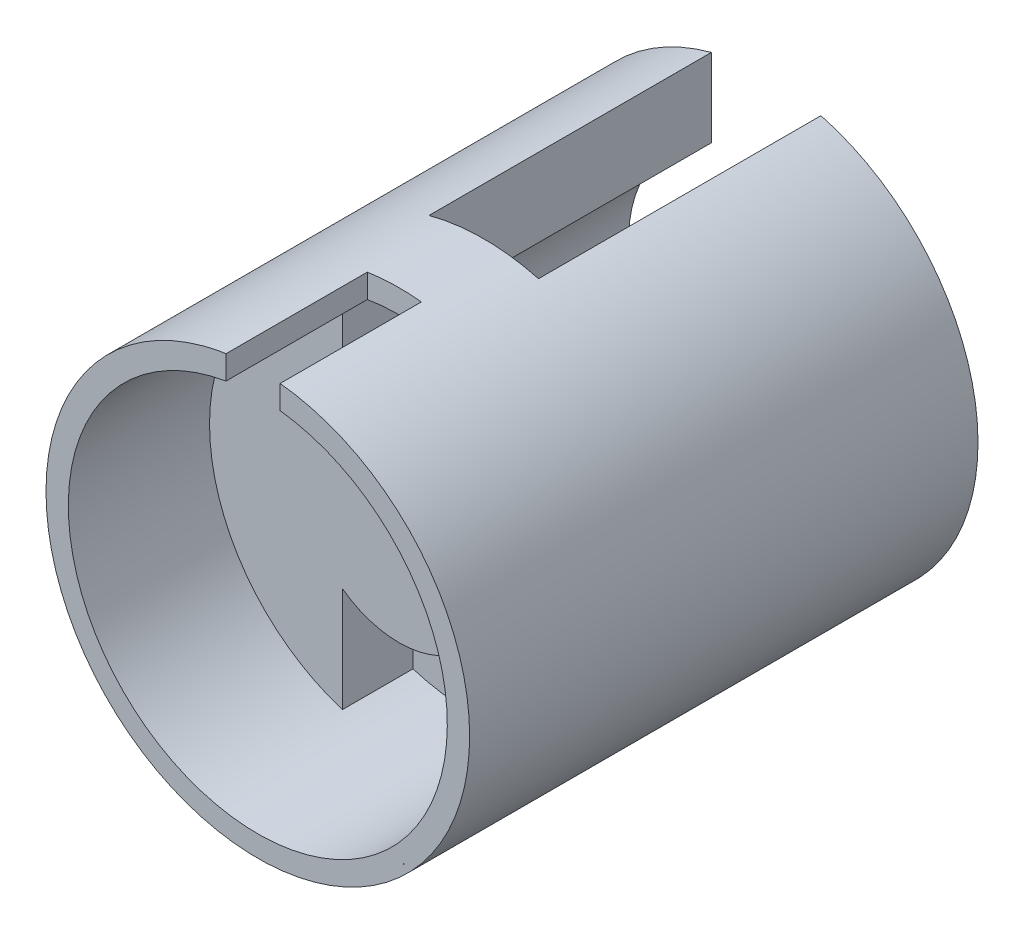
ISO-10303-21;
HEADER;
FILE_DESCRIPTION(('STEP AP214'),'2;1');
FILE_NAME('part.step','',(''),(''),'','','');
FILE_SCHEMA(('AUTOMOTIVE_DESIGN { 1 0 10303 214 1 1 1 1 }'));
ENDSEC;
DATA;
#1=APPLICATION_CONTEXT('core data for automotive mechanical design processes');
#2=APPLICATION_PROTOCOL_DEFINITION('international standard','automotive_design',2000,#1);
#3=PRODUCT_CONTEXT('',#1,'mechanical');
#4=PRODUCT('Part','Part','',(#3));
#5=PRODUCT_RELATED_PRODUCT_CATEGORY('part','',(#4));
#6=PRODUCT_DEFINITION_FORMATION('','',#4);
#7=PRODUCT_DEFINITION_CONTEXT('part definition',#1,'design');
#8=PRODUCT_DEFINITION('design','',#6,#7);
#9=PRODUCT_DEFINITION_SHAPE('','',#8);
#10=(LENGTH_UNIT() NAMED_UNIT(*) SI_UNIT(.MILLI.,.METRE.));
#11=(NAMED_UNIT(*) PLANE_ANGLE_UNIT() SI_UNIT($,.RADIAN.));
#12=(NAMED_UNIT(*) SI_UNIT($,.STERADIAN.) SOLID_ANGLE_UNIT());
#13=UNCERTAINTY_MEASURE_WITH_UNIT(LENGTH_MEASURE(1.E-05),#10,'distance_accuracy_value','');
#14=(GEOMETRIC_REPRESENTATION_CONTEXT(3) GLOBAL_UNCERTAINTY_ASSIGNED_CONTEXT((#13)) GLOBAL_UNIT_ASSIGNED_CONTEXT((#10,
#11,#12)) REPRESENTATION_CONTEXT('',''));
#15=CARTESIAN_POINT('',(0.,0.,0.));
#16=DIRECTION('',(0.,0.,1.));
#17=DIRECTION('',(1.,0.,0.));
#18=AXIS2_PLACEMENT_3D('',#15,#16,#17);
#19=CARTESIAN_POINT('',(0.15315400495503,2.89672992196875,-1.));
#20=DIRECTION('',(0.,0.,-1.));
#21=DIRECTION('',(-1.,0.,0.));
#22=AXIS2_PLACEMENT_3D('',#19,#20,#21);
#23=PLANE('',#22);
#24=CARTESIAN_POINT('',(0.15315400495503,2.89672992196875,-1.));
#25=DIRECTION('',(0.,0.,-1.));
#26=DIRECTION('',(-1.,0.,0.));
#27=AXIS2_PLACEMENT_3D('',#24,#25,#26);
#28=CIRCLE('',#27,9.75);
#29=CARTESIAN_POINT('',(4.03204794869255,11.8419343228327,-1.));
#30=VERTEX_POINT('',#29);
#31=CARTESIAN_POINT('',(-3.72573993878249,11.8419343228327,-1.));
#32=VERTEX_POINT('',#31);
#33=EDGE_CURVE('E89',#30,#32,#28,.T.);
#34=ORIENTED_EDGE('',*,*,#33,.T.);
#35=DIRECTION('',(0.,1.,0.));
#36=VECTOR('',#35,1.);
#37=CARTESIAN_POINT('',(-3.72573993878249,0.,-1.));
#38=LINE('',#37,#36);
#39=CARTESIAN_POINT('',(-3.72573993878249,17.3865257029049,-1.));
#40=VERTEX_POINT('',#39);
#41=EDGE_CURVE('E208',#32,#40,#38,.T.);
#42=ORIENTED_EDGE('',*,*,#41,.T.);
#43=CARTESIAN_POINT('',(0.15315400495503,2.89672992196875,-1.));
#44=DIRECTION('',(0.,0.,-1.));
#45=DIRECTION('',(-1.,0.,0.));
#46=AXIS2_PLACEMENT_3D('',#43,#44,#45);
#47=CIRCLE('',#46,15.);
#48=CARTESIAN_POINT('',(4.03204794869255,17.3865257029049,-1.));
#49=VERTEX_POINT('',#48);
#50=EDGE_CURVE('E192',#40,#49,#47,.T.);
#51=ORIENTED_EDGE('',*,*,#50,.T.);
#52=DIRECTION('',(0.,1.,0.));
#53=VECTOR('',#52,1.);
#54=CARTESIAN_POINT('',(4.03204794869255,0.,-1.));
#55=LINE('',#54,#53);
#56=EDGE_CURVE('E94',#30,#49,#55,.T.);
#57=ORIENTED_EDGE('',*,*,#56,.F.);
#58=EDGE_LOOP('',(#34,#42,#51,#57));
#59=FACE_BOUND('',#58,.T.);
#60=ADVANCED_FACE('F71',(#59),#23,.T.);
#61=CARTESIAN_POINT('',(0.15315400495503,2.89672992196875,5.));
#62=DIRECTION('',(0.,0.,1.));
#63=DIRECTION('',(1.,0.,0.));
#64=AXIS2_PLACEMENT_3D('',#61,#62,#63);
#65=PLANE('',#64);
#66=DIRECTION('',(0.,1.,0.));
#67=VECTOR('',#66,1.);
#68=CARTESIAN_POINT('',(-3.85836640916608,0.,5.));
#69=LINE('',#68,#67);
#70=CARTESIAN_POINT('',(-3.85836640916608,8.35341079601246,5.));
#71=VERTEX_POINT('',#70);
#72=CARTESIAN_POINT('',(-3.85836640916608,15.6233242508384,5.));
#73=VERTEX_POINT('',#72);
#74=EDGE_CURVE('E329',#71,#73,#69,.T.);
#75=ORIENTED_EDGE('',*,*,#74,.T.);
#76=CARTESIAN_POINT('',(0.15315400495503,2.81808033328069,5.));
#77=DIRECTION('',(0.,0.,1.));
#78=DIRECTION('',(1.,0.,0.));
#79=AXIS2_PLACEMENT_3D('',#76,#77,#78);
#80=CIRCLE('',#79,13.4188884718913);
#81=CARTESIAN_POINT('',(-3.85836640916608,-9.98716358427697,5.));
#82=VERTEX_POINT('',#81);
#83=EDGE_CURVE('E12',#73,#82,#80,.T.);
#84=ORIENTED_EDGE('',*,*,#83,.T.);
#85=DIRECTION('',(0.,-1.,0.));
#86=VECTOR('',#85,1.);
#87=CARTESIAN_POINT('',(-3.85836640916608,0.,5.));
#88=LINE('',#87,#86);
#89=CARTESIAN_POINT('',(-3.85836640916608,-2.55995095207492,5.));
#90=VERTEX_POINT('',#89);
#91=EDGE_CURVE('E280',#90,#82,#88,.T.);
#92=ORIENTED_EDGE('',*,*,#91,.F.);
#93=CARTESIAN_POINT('',(0.15315400495503,2.89672992196875,5.));
#94=DIRECTION('',(0.,0.,1.));
#95=DIRECTION('',(1.,0.,0.));
#96=AXIS2_PLACEMENT_3D('',#93,#94,#95);
#97=CIRCLE('',#96,6.77256688369073);
#98=CARTESIAN_POINT('',(4.16467441907613,-2.55995095207492,5.));
#99=VERTEX_POINT('',#98);
#100=EDGE_CURVE('E276',#90,#99,#97,.T.);
#101=ORIENTED_EDGE('',*,*,#100,.T.);
#102=DIRECTION('',(0.,-1.,0.));
#103=VECTOR('',#102,1.);
#104=CARTESIAN_POINT('',(4.16467441907613,0.,5.));
#105=LINE('',#104,#103);
#106=CARTESIAN_POINT('',(4.16467441907614,-9.98716358427697,5.));
#107=VERTEX_POINT('',#106);
#108=EDGE_CURVE('E285',#99,#107,#105,.T.);
#109=ORIENTED_EDGE('',*,*,#108,.T.);
#110=CARTESIAN_POINT('',(4.16467441907613,15.6233242508384,5.));
#111=VERTEX_POINT('',#110);
#112=EDGE_CURVE('E81',#107,#111,#80,.T.);
#113=ORIENTED_EDGE('',*,*,#112,.T.);
#114=DIRECTION('',(0.,1.,0.));
#115=VECTOR('',#114,1.);
#116=CARTESIAN_POINT('',(4.16467441907614,0.,5.));
#117=LINE('',#116,#115);
#118=CARTESIAN_POINT('',(4.16467441907613,8.35341079601246,5.));
#119=VERTEX_POINT('',#118);
#120=EDGE_CURVE('E320',#119,#111,#117,.T.);
#121=ORIENTED_EDGE('',*,*,#120,.F.);
#122=CARTESIAN_POINT('',(0.15315400495503,2.89672992196875,5.));
#123=DIRECTION('',(0.,0.,1.));
#124=DIRECTION('',(1.,0.,0.));
#125=AXIS2_PLACEMENT_3D('',#122,#123,#124);
#126=CIRCLE('',#125,6.77256688369076);
#127=EDGE_CURVE('E316',#119,#71,#126,.T.);
#128=ORIENTED_EDGE('',*,*,#127,.T.);
#129=EDGE_LOOP('',(#75,#84,#92,#101,#109,#113,#121,#128));
#130=FACE_BOUND('',#129,.T.);
#131=ADVANCED_FACE('F367',(#130),#65,.T.);
#132=CARTESIAN_POINT('',(0.15315400495503,2.81808033328069,5.));
#133=DIRECTION('',(0.,0.,1.));
#134=DIRECTION('',(1.,0.,0.));
#135=AXIS2_PLACEMENT_3D('',#132,#133,#134);
#136=CIRCLE('',#135,13.4188884718913);
#137=CARTESIAN_POINT('',(1.7342431924394,16.1434968296713,5.));
#138=VERTEX_POINT('',#137);
#139=CARTESIAN_POINT('',(-2.09412857584462,16.0474525339217,5.));
#140=VERTEX_POINT('',#139);
#141=EDGE_CURVE('E325',#138,#140,#136,.T.);
#142=ORIENTED_EDGE('',*,*,#141,.F.);
#143=DIRECTION('',(0.,1.,0.));
#144=VECTOR('',#143,1.);
#145=CARTESIAN_POINT('',(1.7342431924394,0.,5.));
#146=LINE('',#145,#144);
#147=CARTESIAN_POINT('',(1.7342431924394,17.8131690741666,5.));
#148=VERTEX_POINT('',#147);
#149=EDGE_CURVE('E257',#138,#148,#146,.T.);
#150=ORIENTED_EDGE('',*,*,#149,.T.);
#151=CARTESIAN_POINT('',(0.15315400495503,2.89672992196875,5.));
#152=DIRECTION('',(0.,0.,1.));
#153=DIRECTION('',(1.,0.,0.));
#154=AXIS2_PLACEMENT_3D('',#151,#152,#153);
#155=CIRCLE('',#154,15.);
#156=CARTESIAN_POINT('',(-2.09412857584463,17.7274318946346,5.));
#157=VERTEX_POINT('',#156);
#158=EDGE_CURVE('E75',#148,#157,#155,.T.);
#159=ORIENTED_EDGE('',*,*,#158,.T.);
#160=DIRECTION('',(0.,-1.,0.));
#161=VECTOR('',#160,1.);
#162=CARTESIAN_POINT('',(-2.09412857584462,0.,5.));
#163=LINE('',#162,#161);
#164=EDGE_CURVE('E232',#157,#140,#163,.T.);
#165=ORIENTED_EDGE('',*,*,#164,.T.);
#166=EDGE_LOOP('',(#142,#150,#159,#165));
#167=FACE_BOUND('',#166,.T.);
#168=ADVANCED_FACE('F417',(#167),#65,.T.);
#169=CARTESIAN_POINT('',(0.15315400495503,2.89672992196875,5.));
#170=DIRECTION('',(0.,0.,-1.));
#171=DIRECTION('',(-1.,0.,0.));
#172=AXIS2_PLACEMENT_3D('',#169,#170,#171);
#173=CYLINDRICAL_SURFACE('',#172,15.);
#174=ORIENTED_EDGE('',*,*,#158,.F.);
#175=DIRECTION('',(0.,0.,-1.));
#176=VECTOR('',#175,1.);
#177=CARTESIAN_POINT('',(1.7342431924394,17.8131690741666,15.));
#178=LINE('',#177,#176);
#179=CARTESIAN_POINT('',(1.7342431924394,17.8131690741666,15.));
#180=VERTEX_POINT('',#179);
#181=EDGE_CURVE('E266',#180,#148,#178,.T.);
#182=ORIENTED_EDGE('',*,*,#181,.F.);
#183=CARTESIAN_POINT('',(0.15315400495503,2.89672992196875,15.));
#184=DIRECTION('',(0.,0.,1.));
#185=DIRECTION('',(1.,0.,0.));
#186=AXIS2_PLACEMENT_3D('',#183,#184,#185);
#187=CIRCLE('',#186,15.);
#188=CARTESIAN_POINT('',(-2.09412857584463,17.7274318946346,15.));
#189=VERTEX_POINT('',#188);
#190=EDGE_CURVE('E242',#189,#180,#187,.T.);
#191=ORIENTED_EDGE('',*,*,#190,.F.);
#192=DIRECTION('',(0.,0.,-1.));
#193=VECTOR('',#192,1.);
#194=CARTESIAN_POINT('',(-2.09412857584463,17.7274318946346,15.));
#195=LINE('',#194,#193);
#196=EDGE_CURVE('E269',#189,#157,#195,.T.);
#197=ORIENTED_EDGE('',*,*,#196,.T.);
#198=EDGE_LOOP('',(#174,#182,#191,#197));
#199=FACE_BOUND('',#198,.T.);
#200=ORIENTED_EDGE('',*,*,#50,.F.);
#201=DIRECTION('',(0.,0.,1.));
#202=VECTOR('',#201,1.);
#203=CARTESIAN_POINT('',(-3.72573993878249,17.3865257029049,-21.));
#204=LINE('',#203,#202);
#205=CARTESIAN_POINT('',(-3.72573993878249,17.3865257029049,-21.));
#206=VERTEX_POINT('',#205);
#207=EDGE_CURVE('E224',#206,#40,#204,.T.);
#208=ORIENTED_EDGE('',*,*,#207,.F.);
#209=CARTESIAN_POINT('',(0.15315400495503,2.89672992196875,-21.));
#210=DIRECTION('',(0.,0.,-1.));
#211=DIRECTION('',(-1.,0.,0.));
#212=AXIS2_PLACEMENT_3D('',#209,#210,#211);
#213=CIRCLE('',#212,15.);
#214=CARTESIAN_POINT('',(4.03204794869255,17.3865257029049,-21.));
#215=VERTEX_POINT('',#214);
#216=EDGE_CURVE('E202',#215,#206,#213,.T.);
#217=ORIENTED_EDGE('',*,*,#216,.F.);
#218=DIRECTION('',(0.,0.,1.));
#219=VECTOR('',#218,1.);
#220=CARTESIAN_POINT('',(4.03204794869255,17.3865257029049,-21.));
#221=LINE('',#220,#219);
#222=EDGE_CURVE('E193',#215,#49,#221,.T.);
#223=ORIENTED_EDGE('',*,*,#222,.T.);
#224=EDGE_LOOP('',(#200,#208,#217,#223));
#225=FACE_BOUND('',#224,.T.);
#226=ADVANCED_FACE('F73',(#199,#225),#173,.T.);
#227=CARTESIAN_POINT('',(0.15315400495503,2.89672992196875,5.));
#228=DIRECTION('',(0.,0.,-1.));
#229=DIRECTION('',(-1.,0.,0.));
#230=AXIS2_PLACEMENT_3D('',#227,#228,#229);
#231=CYLINDRICAL_SURFACE('',#230,6.77256688369076);
#232=CARTESIAN_POINT('',(0.15315400495503,2.89672992196875,0.));
#233=DIRECTION('',(0.,0.,1.));
#234=DIRECTION('',(1.,0.,0.));
#235=AXIS2_PLACEMENT_3D('',#232,#233,#234);
#236=CIRCLE('',#235,6.77256688369076);
#237=CARTESIAN_POINT('',(4.16467441907613,8.35341079601246,0.));
#238=VERTEX_POINT('',#237);
#239=CARTESIAN_POINT('',(-3.85836640916608,8.35341079601246,0.));
#240=VERTEX_POINT('',#239);
#241=EDGE_CURVE('E315',#238,#240,#236,.T.);
#242=ORIENTED_EDGE('',*,*,#241,.T.);
#243=DIRECTION('',(0.,0.,-1.));
#244=VECTOR('',#243,1.);
#245=CARTESIAN_POINT('',(-3.85836640916608,8.35341079601246,5.));
#246=LINE('',#245,#244);
#247=EDGE_CURVE('E333',#71,#240,#246,.T.);
#248=ORIENTED_EDGE('',*,*,#247,.F.);
#249=ORIENTED_EDGE('',*,*,#127,.F.);
#250=DIRECTION('',(0.,0.,-1.));
#251=VECTOR('',#250,1.);
#252=CARTESIAN_POINT('',(4.16467441907613,8.35341079601246,5.));
#253=LINE('',#252,#251);
#254=EDGE_CURVE('E355',#119,#238,#253,.T.);
#255=ORIENTED_EDGE('',*,*,#254,.T.);
#256=EDGE_LOOP('',(#242,#248,#249,#255));
#257=FACE_BOUND('',#256,.T.);
#258=ADVANCED_FACE('F382',(#257),#231,.T.);
#259=CARTESIAN_POINT('',(4.16467441907614,0.,5.));
#260=DIRECTION('',(-1.,0.,0.));
#261=DIRECTION('',(0.,-1.,0.));
#262=AXIS2_PLACEMENT_3D('',#259,#260,#261);
#263=PLANE('',#262);
#264=DIRECTION('',(0.,1.,0.));
#265=VECTOR('',#264,1.);
#266=CARTESIAN_POINT('',(4.16467441907614,0.,0.));
#267=LINE('',#266,#265);
#268=CARTESIAN_POINT('',(4.16467441907613,15.6233242508384,0.));
#269=VERTEX_POINT('',#268);
#270=EDGE_CURVE('E336',#238,#269,#267,.T.);
#271=ORIENTED_EDGE('',*,*,#270,.F.);
#272=ORIENTED_EDGE('',*,*,#254,.F.);
#273=ORIENTED_EDGE('',*,*,#120,.T.);
#274=DIRECTION('',(0.,0.,-1.));
#275=VECTOR('',#274,1.);
#276=CARTESIAN_POINT('',(4.16467441907613,15.6233242508384,5.));
#277=LINE('',#276,#275);
#278=EDGE_CURVE('E353',#111,#269,#277,.T.);
#279=ORIENTED_EDGE('',*,*,#278,.T.);
#280=EDGE_LOOP('',(#271,#272,#273,#279));
#281=FACE_BOUND('',#280,.T.);
#282=ADVANCED_FACE('F373',(#281),#263,.T.);
#283=CARTESIAN_POINT('',(0.15315400495503,2.81808033328069,5.));
#284=DIRECTION('',(0.,0.,-1.));
#285=DIRECTION('',(-1.,0.,0.));
#286=AXIS2_PLACEMENT_3D('',#283,#284,#285);
#287=CYLINDRICAL_SURFACE('',#286,13.4188884718913);
#288=ORIENTED_EDGE('',*,*,#83,.F.);
#289=DIRECTION('',(0.,0.,-1.));
#290=VECTOR('',#289,1.);
#291=CARTESIAN_POINT('',(-3.85836640916608,15.6233242508384,5.));
#292=LINE('',#291,#290);
#293=CARTESIAN_POINT('',(-3.85836640916608,15.6233242508384,0.));
#294=VERTEX_POINT('',#293);
#295=EDGE_CURVE('E349',#73,#294,#292,.T.);
#296=ORIENTED_EDGE('',*,*,#295,.T.);
#297=CARTESIAN_POINT('',(0.15315400495503,2.81808033328069,0.));
#298=DIRECTION('',(0.,0.,1.));
#299=DIRECTION('',(1.,0.,0.));
#300=AXIS2_PLACEMENT_3D('',#297,#298,#299);
#301=CIRCLE('',#300,13.4188884718913);
#302=EDGE_CURVE('E340',#269,#294,#301,.T.);
#303=ORIENTED_EDGE('',*,*,#302,.F.);
#304=ORIENTED_EDGE('',*,*,#278,.F.);
#305=ORIENTED_EDGE('',*,*,#112,.F.);
#306=DIRECTION('',(0.,0.,-1.));
#307=VECTOR('',#306,1.);
#308=CARTESIAN_POINT('',(4.16467441907614,-9.98716358427697,5.));
#309=LINE('',#308,#307);
#310=CARTESIAN_POINT('',(4.16467441907614,-9.98716358427697,0.));
#311=VERTEX_POINT('',#310);
#312=EDGE_CURVE('E305',#107,#311,#309,.T.);
#313=ORIENTED_EDGE('',*,*,#312,.T.);
#314=CARTESIAN_POINT('',(0.15315400495503,2.81808033328069,0.));
#315=DIRECTION('',(0.,0.,1.));
#316=DIRECTION('',(1.,0.,0.));
#317=AXIS2_PLACEMENT_3D('',#314,#315,#316);
#318=CIRCLE('',#317,13.4188884718913);
#319=CARTESIAN_POINT('',(-3.85836640916608,-9.98716358427697,0.));
#320=VERTEX_POINT('',#319);
#321=EDGE_CURVE('E296',#320,#311,#318,.T.);
#322=ORIENTED_EDGE('',*,*,#321,.F.);
#323=DIRECTION('',(0.,0.,-1.));
#324=VECTOR('',#323,1.);
#325=CARTESIAN_POINT('',(-3.85836640916608,-9.98716358427697,5.));
#326=LINE('',#325,#324);
#327=EDGE_CURVE('E309',#82,#320,#326,.T.);
#328=ORIENTED_EDGE('',*,*,#327,.F.);
#329=EDGE_LOOP('',(#288,#296,#303,#304,#305,#313,#322,#328));
#330=FACE_BOUND('',#329,.T.);
#331=ORIENTED_EDGE('',*,*,#141,.T.);
#332=DIRECTION('',(0.,0.,-1.));
#333=VECTOR('',#332,1.);
#334=CARTESIAN_POINT('',(-2.09412857584462,16.0474525339217,15.));
#335=LINE('',#334,#333);
#336=CARTESIAN_POINT('',(-2.09412857584462,16.0474525339217,15.));
#337=VERTEX_POINT('',#336);
#338=EDGE_CURVE('E272',#337,#140,#335,.T.);
#339=ORIENTED_EDGE('',*,*,#338,.F.);
#340=CARTESIAN_POINT('',(0.15315400495503,2.81808033328069,15.));
#341=DIRECTION('',(0.,0.,1.));
#342=DIRECTION('',(1.,0.,0.));
#343=AXIS2_PLACEMENT_3D('',#340,#341,#342);
#344=CIRCLE('',#343,13.4188884718913);
#345=CARTESIAN_POINT('',(1.7342431924394,16.1434968296713,15.));
#346=VERTEX_POINT('',#345);
#347=EDGE_CURVE('E233',#337,#346,#344,.T.);
#348=ORIENTED_EDGE('',*,*,#347,.T.);
#349=DIRECTION('',(0.,0.,-1.));
#350=VECTOR('',#349,1.);
#351=CARTESIAN_POINT('',(1.7342431924394,16.1434968296713,15.));
#352=LINE('',#351,#350);
#353=EDGE_CURVE('E252',#346,#138,#352,.T.);
#354=ORIENTED_EDGE('',*,*,#353,.T.);
#355=EDGE_LOOP('',(#331,#339,#348,#354));
#356=FACE_BOUND('',#355,.T.);
#357=ADVANCED_FACE('F375',(#330,#356),#287,.F.);
#358=CARTESIAN_POINT('',(-3.85836640916608,0.,5.));
#359=DIRECTION('',(-1.,0.,0.));
#360=DIRECTION('',(0.,0.,1.));
#361=AXIS2_PLACEMENT_3D('',#358,#359,#360);
#362=PLANE('',#361);
#363=DIRECTION('',(0.,1.,0.));
#364=VECTOR('',#363,1.);
#365=CARTESIAN_POINT('',(-3.85836640916608,0.,0.));
#366=LINE('',#365,#364);
#367=EDGE_CURVE('E321',#240,#294,#366,.T.);
#368=ORIENTED_EDGE('',*,*,#367,.T.);
#369=ORIENTED_EDGE('',*,*,#295,.F.);
#370=ORIENTED_EDGE('',*,*,#74,.F.);
#371=ORIENTED_EDGE('',*,*,#247,.T.);
#372=EDGE_LOOP('',(#368,#369,#370,#371));
#373=FACE_BOUND('',#372,.T.);
#374=ADVANCED_FACE('F385',(#373),#362,.F.);
#375=CARTESIAN_POINT('',(0.15315400495503,2.89672992196875,5.));
#376=DIRECTION('',(0.,0.,-1.));
#377=DIRECTION('',(-1.,0.,0.));
#378=AXIS2_PLACEMENT_3D('',#375,#376,#377);
#379=CYLINDRICAL_SURFACE('',#378,6.77256688369073);
#380=CARTESIAN_POINT('',(0.15315400495503,2.89672992196875,0.));
#381=DIRECTION('',(0.,0.,1.));
#382=DIRECTION('',(1.,0.,0.));
#383=AXIS2_PLACEMENT_3D('',#380,#381,#382);
#384=CIRCLE('',#383,6.77256688369073);
#385=CARTESIAN_POINT('',(-3.85836640916608,-2.55995095207492,0.));
#386=VERTEX_POINT('',#385);
#387=CARTESIAN_POINT('',(4.16467441907614,-2.55995095207492,0.));
#388=VERTEX_POINT('',#387);
#389=EDGE_CURVE('E275',#386,#388,#384,.T.);
#390=ORIENTED_EDGE('',*,*,#389,.T.);
#391=DIRECTION('',(0.,0.,-1.));
#392=VECTOR('',#391,1.);
#393=CARTESIAN_POINT('',(4.16467441907613,-2.55995095207492,5.));
#394=LINE('',#393,#392);
#395=EDGE_CURVE('E289',#99,#388,#394,.T.);
#396=ORIENTED_EDGE('',*,*,#395,.F.);
#397=ORIENTED_EDGE('',*,*,#100,.F.);
#398=DIRECTION('',(0.,0.,-1.));
#399=VECTOR('',#398,1.);
#400=CARTESIAN_POINT('',(-3.85836640916608,-2.55995095207492,5.));
#401=LINE('',#400,#399);
#402=EDGE_CURVE('E312',#90,#386,#401,.T.);
#403=ORIENTED_EDGE('',*,*,#402,.T.);
#404=EDGE_LOOP('',(#390,#396,#397,#403));
#405=FACE_BOUND('',#404,.T.);
#406=ADVANCED_FACE('F398',(#405),#379,.T.);
#407=CARTESIAN_POINT('',(-3.85836640916608,0.,5.));
#408=DIRECTION('',(1.,0.,0.));
#409=DIRECTION('',(0.,1.,0.));
#410=AXIS2_PLACEMENT_3D('',#407,#408,#409);
#411=PLANE('',#410);
#412=DIRECTION('',(0.,-1.,0.));
#413=VECTOR('',#412,1.);
#414=CARTESIAN_POINT('',(-3.85836640916608,0.,0.));
#415=LINE('',#414,#413);
#416=EDGE_CURVE('E292',#386,#320,#415,.T.);
#417=ORIENTED_EDGE('',*,*,#416,.F.);
#418=ORIENTED_EDGE('',*,*,#402,.F.);
#419=ORIENTED_EDGE('',*,*,#91,.T.);
#420=ORIENTED_EDGE('',*,*,#327,.T.);
#421=EDGE_LOOP('',(#417,#418,#419,#420));
#422=FACE_BOUND('',#421,.T.);
#423=ADVANCED_FACE('F390',(#422),#411,.T.);
#424=CARTESIAN_POINT('',(4.16467441907613,0.,5.));
#425=DIRECTION('',(1.,0.,0.));
#426=DIRECTION('',(0.,1.,0.));
#427=AXIS2_PLACEMENT_3D('',#424,#425,#426);
#428=PLANE('',#427);
#429=DIRECTION('',(0.,-1.,0.));
#430=VECTOR('',#429,1.);
#431=CARTESIAN_POINT('',(4.16467441907613,0.,0.));
#432=LINE('',#431,#430);
#433=EDGE_CURVE('E281',#388,#311,#432,.T.);
#434=ORIENTED_EDGE('',*,*,#433,.T.);
#435=ORIENTED_EDGE('',*,*,#312,.F.);
#436=ORIENTED_EDGE('',*,*,#108,.F.);
#437=ORIENTED_EDGE('',*,*,#395,.T.);
#438=EDGE_LOOP('',(#434,#435,#436,#437));
#439=FACE_BOUND('',#438,.T.);
#440=ADVANCED_FACE('F400',(#439),#428,.F.);
#441=CARTESIAN_POINT('',(-2.09412857584462,0.,15.));
#442=DIRECTION('',(1.,0.,0.));
#443=DIRECTION('',(0.,1.,0.));
#444=AXIS2_PLACEMENT_3D('',#441,#442,#443);
#445=PLANE('',#444);
#446=ORIENTED_EDGE('',*,*,#164,.F.);
#447=ORIENTED_EDGE('',*,*,#196,.F.);
#448=DIRECTION('',(0.,-1.,0.));
#449=VECTOR('',#448,1.);
#450=CARTESIAN_POINT('',(-2.09412857584462,0.,15.));
#451=LINE('',#450,#449);
#452=EDGE_CURVE('E237',#189,#337,#451,.T.);
#453=ORIENTED_EDGE('',*,*,#452,.T.);
#454=ORIENTED_EDGE('',*,*,#338,.T.);
#455=EDGE_LOOP('',(#446,#447,#453,#454));
#456=FACE_BOUND('',#455,.T.);
#457=ADVANCED_FACE('F402',(#456),#445,.T.);
#458=CARTESIAN_POINT('',(1.7342431924394,0.,15.));
#459=DIRECTION('',(-1.,0.,0.));
#460=DIRECTION('',(0.,-1.,0.));
#461=AXIS2_PLACEMENT_3D('',#458,#459,#460);
#462=PLANE('',#461);
#463=ORIENTED_EDGE('',*,*,#149,.F.);
#464=ORIENTED_EDGE('',*,*,#353,.F.);
#465=DIRECTION('',(0.,1.,0.));
#466=VECTOR('',#465,1.);
#467=CARTESIAN_POINT('',(1.7342431924394,0.,15.));
#468=LINE('',#467,#466);
#469=EDGE_CURVE('E245',#346,#180,#468,.T.);
#470=ORIENTED_EDGE('',*,*,#469,.T.);
#471=ORIENTED_EDGE('',*,*,#181,.T.);
#472=EDGE_LOOP('',(#463,#464,#470,#471));
#473=FACE_BOUND('',#472,.T.);
#474=ADVANCED_FACE('F408',(#473),#462,.T.);
#475=CARTESIAN_POINT('',(10.4918472971162,-7.27617805785591,15.));
#476=DIRECTION('',(0.,0.,-1.));
#477=DIRECTION('',(-1.,0.,0.));
#478=AXIS2_PLACEMENT_3D('',#475,#476,#477);
#479=CYLINDRICAL_SURFACE('',#478,0.0267165322474262);
#480=CARTESIAN_POINT('',(10.4918472971162,-7.27617805785591,15.));
#481=DIRECTION('',(0.,0.,1.));
#482=DIRECTION('',(1.,0.,0.));
#483=AXIS2_PLACEMENT_3D('',#480,#481,#482);
#484=CIRCLE('',#483,0.0267165322474262);
#485=CARTESIAN_POINT('',(10.5185638293636,-7.27617805785591,15.));
#486=VERTEX_POINT('',#485);
#487=EDGE_CURVE('E249',#486,#486,#484,.T.);
#488=ORIENTED_EDGE('',*,*,#487,.T.);
#489=EDGE_LOOP('',(#488));
#490=FACE_BOUND('',#489,.T.);
#491=CARTESIAN_POINT('',(10.4918472971162,-7.27617805785591,5.));
#492=DIRECTION('',(0.,0.,1.));
#493=DIRECTION('',(1.,0.,0.));
#494=AXIS2_PLACEMENT_3D('',#491,#492,#493);
#495=CIRCLE('',#494,0.0267165322474262);
#496=CARTESIAN_POINT('',(10.5185638293636,-7.27617805785591,5.));
#497=VERTEX_POINT('',#496);
#498=EDGE_CURVE('E238',#497,#497,#495,.T.);
#499=ORIENTED_EDGE('',*,*,#498,.F.);
#500=EDGE_LOOP('',(#499));
#501=FACE_BOUND('',#500,.T.);
#502=ADVANCED_FACE('F427',(#490,#501),#479,.F.);
#503=CARTESIAN_POINT('',(0.,0.,15.));
#504=DIRECTION('',(0.,0.,1.));
#505=DIRECTION('',(1.,0.,0.));
#506=AXIS2_PLACEMENT_3D('',#503,#504,#505);
#507=PLANE('',#506);
#508=ORIENTED_EDGE('',*,*,#347,.F.);
#509=ORIENTED_EDGE('',*,*,#452,.F.);
#510=ORIENTED_EDGE('',*,*,#190,.T.);
#511=ORIENTED_EDGE('',*,*,#469,.F.);
#512=EDGE_LOOP('',(#508,#509,#510,#511));
#513=FACE_BOUND('',#512,.T.);
#514=ORIENTED_EDGE('',*,*,#487,.F.);
#515=EDGE_LOOP('',(#514));
#516=FACE_BOUND('',#515,.T.);
#517=ADVANCED_FACE('F424',(#513,#516),#507,.T.);
#518=ORIENTED_EDGE('',*,*,#498,.T.);
#519=EDGE_LOOP('',(#518));
#520=FACE_BOUND('',#519,.T.);
#521=ADVANCED_FACE('F418',(#520),#65,.T.);
#522=CARTESIAN_POINT('',(0.15315400495503,2.89672992196875,0.));
#523=DIRECTION('',(0.,0.,-1.));
#524=DIRECTION('',(-1.,0.,0.));
#525=AXIS2_PLACEMENT_3D('',#522,#523,#524);
#526=PLANE('',#525);
#527=ORIENTED_EDGE('',*,*,#367,.F.);
#528=ORIENTED_EDGE('',*,*,#241,.F.);
#529=ORIENTED_EDGE('',*,*,#270,.T.);
#530=ORIENTED_EDGE('',*,*,#302,.T.);
#531=EDGE_LOOP('',(#527,#528,#529,#530));
#532=FACE_BOUND('',#531,.T.);
#533=ADVANCED_FACE('F381',(#532),#526,.F.);
#534=ORIENTED_EDGE('',*,*,#433,.F.);
#535=ORIENTED_EDGE('',*,*,#389,.F.);
#536=ORIENTED_EDGE('',*,*,#416,.T.);
#537=ORIENTED_EDGE('',*,*,#321,.T.);
#538=EDGE_LOOP('',(#534,#535,#536,#537));
#539=FACE_BOUND('',#538,.T.);
#540=ADVANCED_FACE('F396',(#539),#526,.F.);
#541=CARTESIAN_POINT('',(0.15315400495503,2.89672992196875,-21.));
#542=DIRECTION('',(0.,0.,1.));
#543=DIRECTION('',(1.,0.,0.));
#544=AXIS2_PLACEMENT_3D('',#541,#542,#543);
#545=CYLINDRICAL_SURFACE('',#544,9.75);
#546=ORIENTED_EDGE('',*,*,#33,.F.);
#547=DIRECTION('',(0.,0.,1.));
#548=VECTOR('',#547,1.);
#549=CARTESIAN_POINT('',(4.03204794869255,11.8419343228327,-21.));
#550=LINE('',#549,#548);
#551=CARTESIAN_POINT('',(4.03204794869255,11.8419343228327,-21.));
#552=VERTEX_POINT('',#551);
#553=EDGE_CURVE('E184',#552,#30,#550,.T.);
#554=ORIENTED_EDGE('',*,*,#553,.F.);
#555=CARTESIAN_POINT('',(0.15315400495503,2.89672992196875,-21.));
#556=DIRECTION('',(0.,0.,-1.));
#557=DIRECTION('',(-1.,0.,0.));
#558=AXIS2_PLACEMENT_3D('',#555,#556,#557);
#559=CIRCLE('',#558,9.75);
#560=CARTESIAN_POINT('',(-3.72573993878249,11.8419343228327,-21.));
#561=VERTEX_POINT('',#560);
#562=EDGE_CURVE('E188',#552,#561,#559,.T.);
#563=ORIENTED_EDGE('',*,*,#562,.T.);
#564=DIRECTION('',(0.,0.,1.));
#565=VECTOR('',#564,1.);
#566=CARTESIAN_POINT('',(-3.72573993878249,11.8419343228327,-21.));
#567=LINE('',#566,#565);
#568=EDGE_CURVE('E217',#561,#32,#567,.T.);
#569=ORIENTED_EDGE('',*,*,#568,.T.);
#570=EDGE_LOOP('',(#546,#554,#563,#569));
#571=FACE_BOUND('',#570,.T.);
#572=ADVANCED_FACE('F186',(#571),#545,.F.);
#573=CARTESIAN_POINT('',(4.03204794869255,0.,-21.));
#574=DIRECTION('',(1.,0.,0.));
#575=DIRECTION('',(0.,1.,0.));
#576=AXIS2_PLACEMENT_3D('',#573,#574,#575);
#577=PLANE('',#576);
#578=ORIENTED_EDGE('',*,*,#56,.T.);
#579=ORIENTED_EDGE('',*,*,#222,.F.);
#580=DIRECTION('',(0.,1.,0.));
#581=VECTOR('',#580,1.);
#582=CARTESIAN_POINT('',(4.03204794869255,0.,-21.));
#583=LINE('',#582,#581);
#584=EDGE_CURVE('E196',#552,#215,#583,.T.);
#585=ORIENTED_EDGE('',*,*,#584,.F.);
#586=ORIENTED_EDGE('',*,*,#553,.T.);
#587=EDGE_LOOP('',(#578,#579,#585,#586));
#588=FACE_BOUND('',#587,.T.);
#589=ADVANCED_FACE('F197',(#588),#577,.F.);
#590=CARTESIAN_POINT('',(-3.72573993878249,0.,-21.));
#591=DIRECTION('',(1.,0.,0.));
#592=DIRECTION('',(0.,0.,-1.));
#593=AXIS2_PLACEMENT_3D('',#590,#591,#592);
#594=PLANE('',#593);
#595=ORIENTED_EDGE('',*,*,#41,.F.);
#596=ORIENTED_EDGE('',*,*,#568,.F.);
#597=DIRECTION('',(0.,1.,0.));
#598=VECTOR('',#597,1.);
#599=CARTESIAN_POINT('',(-3.72573993878249,0.,-21.));
#600=LINE('',#599,#598);
#601=EDGE_CURVE('E206',#561,#206,#600,.T.);
#602=ORIENTED_EDGE('',*,*,#601,.T.);
#603=ORIENTED_EDGE('',*,*,#207,.T.);
#604=EDGE_LOOP('',(#595,#596,#602,#603));
#605=FACE_BOUND('',#604,.T.);
#606=ADVANCED_FACE('F452',(#605),#594,.T.);
#607=CARTESIAN_POINT('',(0.,0.,-21.));
#608=DIRECTION('',(0.,0.,-1.));
#609=DIRECTION('',(-1.,0.,0.));
#610=AXIS2_PLACEMENT_3D('',#607,#608,#609);
#611=PLANE('',#610);
#612=ORIENTED_EDGE('',*,*,#562,.F.);
#613=ORIENTED_EDGE('',*,*,#584,.T.);
#614=ORIENTED_EDGE('',*,*,#216,.T.);
#615=ORIENTED_EDGE('',*,*,#601,.F.);
#616=EDGE_LOOP('',(#612,#613,#614,#615));
#617=FACE_BOUND('',#616,.T.);
#618=ADVANCED_FACE('F204',(#617),#611,.T.);
#619=CLOSED_SHELL('',(#60,#131,#168,#226,#258,#282,#357,#374,#406,#423,#440,#457,#474,#502,#517,
#521,#533,#540,#572,#589,#606,#618));
#620=MANIFOLD_SOLID_BREP('B2',#619);
#621=ADVANCED_BREP_SHAPE_REPRESENTATION('',(#18,#620),#14);
#622=SHAPE_DEFINITION_REPRESENTATION(#9,#621);
ENDSEC;
END-ISO-10303-21;
